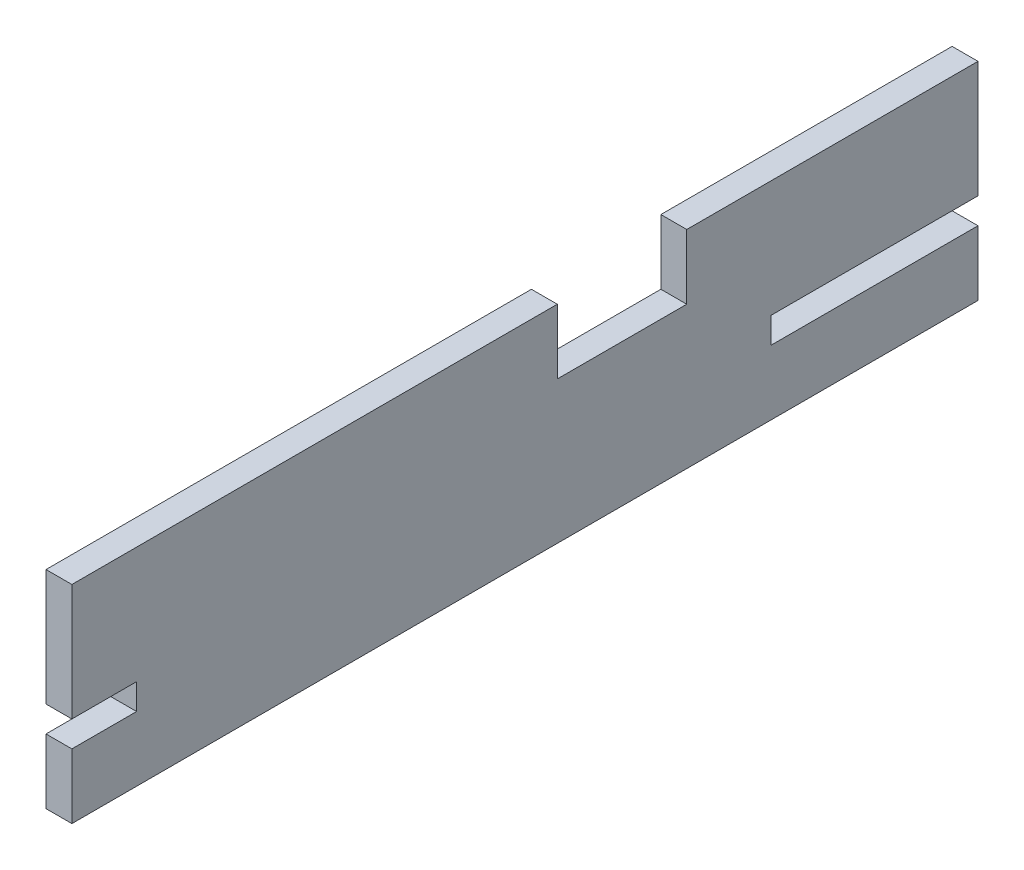
ISO-10303-21;
HEADER;
FILE_DESCRIPTION(('STEP AP214'),'2;1');
FILE_NAME('part.step','',(''),(''),'','','');
FILE_SCHEMA(('AUTOMOTIVE_DESIGN { 1 0 10303 214 1 1 1 1 }'));
ENDSEC;
DATA;
#1=APPLICATION_CONTEXT('core data for automotive mechanical design processes');
#2=APPLICATION_PROTOCOL_DEFINITION('international standard','automotive_design',2000,#1);
#3=PRODUCT_CONTEXT('',#1,'mechanical');
#4=PRODUCT('Part','Part','',(#3));
#5=PRODUCT_RELATED_PRODUCT_CATEGORY('part','',(#4));
#6=PRODUCT_DEFINITION_FORMATION('','',#4);
#7=PRODUCT_DEFINITION_CONTEXT('part definition',#1,'design');
#8=PRODUCT_DEFINITION('design','',#6,#7);
#9=PRODUCT_DEFINITION_SHAPE('','',#8);
#10=(LENGTH_UNIT() NAMED_UNIT(*) SI_UNIT(.MILLI.,.METRE.));
#11=(NAMED_UNIT(*) PLANE_ANGLE_UNIT() SI_UNIT($,.RADIAN.));
#12=(NAMED_UNIT(*) SI_UNIT($,.STERADIAN.) SOLID_ANGLE_UNIT());
#13=UNCERTAINTY_MEASURE_WITH_UNIT(LENGTH_MEASURE(1.E-05),#10,'distance_accuracy_value','');
#14=(GEOMETRIC_REPRESENTATION_CONTEXT(3) GLOBAL_UNCERTAINTY_ASSIGNED_CONTEXT((#13)) GLOBAL_UNIT_ASSIGNED_CONTEXT((#10,
#11,#12)) REPRESENTATION_CONTEXT('',''));
#15=CARTESIAN_POINT('',(0.,0.,0.));
#16=DIRECTION('',(0.,0.,1.));
#17=DIRECTION('',(1.,0.,0.));
#18=AXIS2_PLACEMENT_3D('',#15,#16,#17);
#19=CARTESIAN_POINT('',(4.,15.5611839884913,-15.3184333224336));
#20=DIRECTION('',(0.,-1.,0.));
#21=DIRECTION('',(0.,0.,-1.));
#22=AXIS2_PLACEMENT_3D('',#19,#20,#21);
#23=PLANE('',#22);
#24=DIRECTION('',(0.,0.,1.));
#25=VECTOR('',#24,1.);
#26=CARTESIAN_POINT('',(0.,15.5611839884913,-15.3184333224336));
#27=LINE('',#26,#25);
#28=CARTESIAN_POINT('',(0.,15.5611839884913,-15.3184333224336));
#29=VERTEX_POINT('',#28);
#30=CARTESIAN_POINT('',(0.,15.5611839884913,59.6815666775664));
#31=VERTEX_POINT('',#30);
#32=EDGE_CURVE('E188',#29,#31,#27,.T.);
#33=ORIENTED_EDGE('',*,*,#32,.T.);
#34=DIRECTION('',(-1.,0.,0.));
#35=VECTOR('',#34,1.);
#36=CARTESIAN_POINT('',(4.,15.5611839884913,59.6815666775664));
#37=LINE('',#36,#35);
#38=CARTESIAN_POINT('',(4.,15.5611839884913,59.6815666775664));
#39=VERTEX_POINT('',#38);
#40=EDGE_CURVE('E11',#39,#31,#37,.T.);
#41=ORIENTED_EDGE('',*,*,#40,.F.);
#42=DIRECTION('',(0.,0.,1.));
#43=VECTOR('',#42,1.);
#44=CARTESIAN_POINT('',(4.,15.5611839884913,-15.3184333224336));
#45=LINE('',#44,#43);
#46=CARTESIAN_POINT('',(4.,15.5611839884913,-15.3184333224336));
#47=VERTEX_POINT('',#46);
#48=EDGE_CURVE('E234',#47,#39,#45,.T.);
#49=ORIENTED_EDGE('',*,*,#48,.F.);
#50=DIRECTION('',(-1.,0.,0.));
#51=VECTOR('',#50,1.);
#52=CARTESIAN_POINT('',(4.,15.5611839884913,-15.3184333224336));
#53=LINE('',#52,#51);
#54=EDGE_CURVE('E184',#47,#29,#53,.T.);
#55=ORIENTED_EDGE('',*,*,#54,.T.);
#56=EDGE_LOOP('',(#33,#41,#49,#55));
#57=FACE_BOUND('',#56,.T.);
#58=ADVANCED_FACE('F39',(#57),#23,.F.);
#59=CARTESIAN_POINT('',(4.,15.5611839884913,59.6815666775664));
#60=DIRECTION('',(0.,0.,-1.));
#61=DIRECTION('',(-1.,0.,0.));
#62=AXIS2_PLACEMENT_3D('',#59,#60,#61);
#63=PLANE('',#62);
#64=DIRECTION('',(0.,-1.,0.));
#65=VECTOR('',#64,1.);
#66=CARTESIAN_POINT('',(0.,15.5611839884913,59.6815666775664));
#67=LINE('',#66,#65);
#68=CARTESIAN_POINT('',(0.,-2.43881601150869,59.6815666775664));
#69=VERTEX_POINT('',#68);
#70=EDGE_CURVE('E192',#31,#69,#67,.T.);
#71=ORIENTED_EDGE('',*,*,#70,.T.);
#72=DIRECTION('',(-1.,0.,0.));
#73=VECTOR('',#72,1.);
#74=CARTESIAN_POINT('',(4.,-2.43881601150869,59.6815666775664));
#75=LINE('',#74,#73);
#76=CARTESIAN_POINT('',(4.,-2.43881601150869,59.6815666775664));
#77=VERTEX_POINT('',#76);
#78=EDGE_CURVE('E48',#77,#69,#75,.T.);
#79=ORIENTED_EDGE('',*,*,#78,.F.);
#80=DIRECTION('',(0.,-1.,0.));
#81=VECTOR('',#80,1.);
#82=CARTESIAN_POINT('',(4.,15.5611839884913,59.6815666775664));
#83=LINE('',#82,#81);
#84=EDGE_CURVE('E123',#39,#77,#83,.T.);
#85=ORIENTED_EDGE('',*,*,#84,.F.);
#86=ORIENTED_EDGE('',*,*,#40,.T.);
#87=EDGE_LOOP('',(#71,#79,#85,#86));
#88=FACE_BOUND('',#87,.T.);
#89=ADVANCED_FACE('F356',(#88),#63,.F.);
#90=CARTESIAN_POINT('',(4.,-2.43881601150869,59.6815666775664));
#91=DIRECTION('',(0.,1.,0.));
#92=DIRECTION('',(0.,0.,1.));
#93=AXIS2_PLACEMENT_3D('',#90,#91,#92);
#94=PLANE('',#93);
#95=DIRECTION('',(0.,0.,-1.));
#96=VECTOR('',#95,1.);
#97=CARTESIAN_POINT('',(0.,-2.43881601150869,59.6815666775664));
#98=LINE('',#97,#96);
#99=CARTESIAN_POINT('',(0.,-2.43881601150869,49.6815666775664));
#100=VERTEX_POINT('',#99);
#101=EDGE_CURVE('E195',#69,#100,#98,.T.);
#102=ORIENTED_EDGE('',*,*,#101,.T.);
#103=DIRECTION('',(-1.,0.,0.));
#104=VECTOR('',#103,1.);
#105=CARTESIAN_POINT('',(4.,-2.43881601150869,49.6815666775664));
#106=LINE('',#105,#104);
#107=CARTESIAN_POINT('',(4.,-2.43881601150869,49.6815666775664));
#108=VERTEX_POINT('',#107);
#109=EDGE_CURVE('E277',#108,#100,#106,.T.);
#110=ORIENTED_EDGE('',*,*,#109,.F.);
#111=DIRECTION('',(0.,0.,-1.));
#112=VECTOR('',#111,1.);
#113=CARTESIAN_POINT('',(4.,-2.43881601150869,59.6815666775664));
#114=LINE('',#113,#112);
#115=EDGE_CURVE('E287',#77,#108,#114,.T.);
#116=ORIENTED_EDGE('',*,*,#115,.F.);
#117=ORIENTED_EDGE('',*,*,#78,.T.);
#118=EDGE_LOOP('',(#102,#110,#116,#117));
#119=FACE_BOUND('',#118,.T.);
#120=ADVANCED_FACE('F285',(#119),#94,.F.);
#121=CARTESIAN_POINT('',(4.,-2.43881601150869,49.6815666775664));
#122=DIRECTION('',(0.,0.,-1.));
#123=DIRECTION('',(-1.,0.,0.));
#124=AXIS2_PLACEMENT_3D('',#121,#122,#123);
#125=PLANE('',#124);
#126=DIRECTION('',(0.,-1.,0.));
#127=VECTOR('',#126,1.);
#128=CARTESIAN_POINT('',(0.,-2.43881601150869,49.6815666775664));
#129=LINE('',#128,#127);
#130=CARTESIAN_POINT('',(0.,-6.43881601150869,49.6815666775664));
#131=VERTEX_POINT('',#130);
#132=EDGE_CURVE('E198',#100,#131,#129,.T.);
#133=ORIENTED_EDGE('',*,*,#132,.T.);
#134=DIRECTION('',(-1.,0.,0.));
#135=VECTOR('',#134,1.);
#136=CARTESIAN_POINT('',(4.,-6.43881601150869,49.6815666775664));
#137=LINE('',#136,#135);
#138=CARTESIAN_POINT('',(4.,-6.43881601150869,49.6815666775664));
#139=VERTEX_POINT('',#138);
#140=EDGE_CURVE('E273',#139,#131,#137,.T.);
#141=ORIENTED_EDGE('',*,*,#140,.F.);
#142=DIRECTION('',(0.,-1.,0.));
#143=VECTOR('',#142,1.);
#144=CARTESIAN_POINT('',(4.,-2.43881601150869,49.6815666775664));
#145=LINE('',#144,#143);
#146=EDGE_CURVE('E306',#108,#139,#145,.T.);
#147=ORIENTED_EDGE('',*,*,#146,.F.);
#148=ORIENTED_EDGE('',*,*,#109,.T.);
#149=EDGE_LOOP('',(#133,#141,#147,#148));
#150=FACE_BOUND('',#149,.T.);
#151=ADVANCED_FACE('F296',(#150),#125,.F.);
#152=CARTESIAN_POINT('',(4.,-6.43881601150869,49.6815666775664));
#153=DIRECTION('',(0.,-1.,0.));
#154=DIRECTION('',(0.,0.,-1.));
#155=AXIS2_PLACEMENT_3D('',#152,#153,#154);
#156=PLANE('',#155);
#157=DIRECTION('',(0.,0.,1.));
#158=VECTOR('',#157,1.);
#159=CARTESIAN_POINT('',(0.,-6.43881601150869,49.6815666775664));
#160=LINE('',#159,#158);
#161=CARTESIAN_POINT('',(0.,-6.43881601150869,59.6815666775664));
#162=VERTEX_POINT('',#161);
#163=EDGE_CURVE('E201',#131,#162,#160,.T.);
#164=ORIENTED_EDGE('',*,*,#163,.T.);
#165=DIRECTION('',(-1.,0.,0.));
#166=VECTOR('',#165,1.);
#167=CARTESIAN_POINT('',(4.,-6.43881601150869,59.6815666775664));
#168=LINE('',#167,#166);
#169=CARTESIAN_POINT('',(4.,-6.43881601150869,59.6815666775664));
#170=VERTEX_POINT('',#169);
#171=EDGE_CURVE('E269',#170,#162,#168,.T.);
#172=ORIENTED_EDGE('',*,*,#171,.F.);
#173=DIRECTION('',(0.,0.,1.));
#174=VECTOR('',#173,1.);
#175=CARTESIAN_POINT('',(4.,-6.43881601150869,49.6815666775664));
#176=LINE('',#175,#174);
#177=EDGE_CURVE('E302',#139,#170,#176,.T.);
#178=ORIENTED_EDGE('',*,*,#177,.F.);
#179=ORIENTED_EDGE('',*,*,#140,.T.);
#180=EDGE_LOOP('',(#164,#172,#178,#179));
#181=FACE_BOUND('',#180,.T.);
#182=ADVANCED_FACE('F300',(#181),#156,.F.);
#183=CARTESIAN_POINT('',(4.,-6.43881601150869,59.6815666775664));
#184=DIRECTION('',(0.,0.,-1.));
#185=DIRECTION('',(-1.,0.,0.));
#186=AXIS2_PLACEMENT_3D('',#183,#184,#185);
#187=PLANE('',#186);
#188=DIRECTION('',(0.,-1.,0.));
#189=VECTOR('',#188,1.);
#190=CARTESIAN_POINT('',(0.,-6.43881601150869,59.6815666775664));
#191=LINE('',#190,#189);
#192=CARTESIAN_POINT('',(0.,-16.4388160115087,59.6815666775664));
#193=VERTEX_POINT('',#192);
#194=EDGE_CURVE('E204',#162,#193,#191,.T.);
#195=ORIENTED_EDGE('',*,*,#194,.T.);
#196=DIRECTION('',(-1.,0.,0.));
#197=VECTOR('',#196,1.);
#198=CARTESIAN_POINT('',(4.,-16.4388160115087,59.6815666775664));
#199=LINE('',#198,#197);
#200=CARTESIAN_POINT('',(4.,-16.4388160115087,59.6815666775664));
#201=VERTEX_POINT('',#200);
#202=EDGE_CURVE('E265',#201,#193,#199,.T.);
#203=ORIENTED_EDGE('',*,*,#202,.F.);
#204=DIRECTION('',(0.,-1.,0.));
#205=VECTOR('',#204,1.);
#206=CARTESIAN_POINT('',(4.,-6.43881601150869,59.6815666775664));
#207=LINE('',#206,#205);
#208=EDGE_CURVE('E305',#170,#201,#207,.T.);
#209=ORIENTED_EDGE('',*,*,#208,.F.);
#210=ORIENTED_EDGE('',*,*,#171,.T.);
#211=EDGE_LOOP('',(#195,#203,#209,#210));
#212=FACE_BOUND('',#211,.T.);
#213=ADVANCED_FACE('F369',(#212),#187,.F.);
#214=CARTESIAN_POINT('',(4.,-16.4388160115087,59.6815666775664));
#215=DIRECTION('',(0.,1.,0.));
#216=DIRECTION('',(0.,0.,1.));
#217=AXIS2_PLACEMENT_3D('',#214,#215,#216);
#218=PLANE('',#217);
#219=DIRECTION('',(0.,0.,-1.));
#220=VECTOR('',#219,1.);
#221=CARTESIAN_POINT('',(0.,-16.4388160115087,59.6815666775664));
#222=LINE('',#221,#220);
#223=CARTESIAN_POINT('',(0.,-16.4388160115087,-80.3184333224336));
#224=VERTEX_POINT('',#223);
#225=EDGE_CURVE('E207',#193,#224,#222,.T.);
#226=ORIENTED_EDGE('',*,*,#225,.T.);
#227=DIRECTION('',(-1.,0.,0.));
#228=VECTOR('',#227,1.);
#229=CARTESIAN_POINT('',(4.,-16.4388160115087,-80.3184333224336));
#230=LINE('',#229,#228);
#231=CARTESIAN_POINT('',(4.,-16.4388160115087,-80.3184333224336));
#232=VERTEX_POINT('',#231);
#233=EDGE_CURVE('E261',#232,#224,#230,.T.);
#234=ORIENTED_EDGE('',*,*,#233,.F.);
#235=DIRECTION('',(0.,0.,-1.));
#236=VECTOR('',#235,1.);
#237=CARTESIAN_POINT('',(4.,-16.4388160115087,59.6815666775664));
#238=LINE('',#237,#236);
#239=EDGE_CURVE('E310',#201,#232,#238,.T.);
#240=ORIENTED_EDGE('',*,*,#239,.F.);
#241=ORIENTED_EDGE('',*,*,#202,.T.);
#242=EDGE_LOOP('',(#226,#234,#240,#241));
#243=FACE_BOUND('',#242,.T.);
#244=ADVANCED_FACE('F372',(#243),#218,.F.);
#245=CARTESIAN_POINT('',(4.,-16.4388160115087,-80.3184333224336));
#246=DIRECTION('',(0.,0.,1.));
#247=DIRECTION('',(1.,0.,0.));
#248=AXIS2_PLACEMENT_3D('',#245,#246,#247);
#249=PLANE('',#248);
#250=DIRECTION('',(0.,1.,0.));
#251=VECTOR('',#250,1.);
#252=CARTESIAN_POINT('',(0.,-16.4388160115087,-80.3184333224336));
#253=LINE('',#252,#251);
#254=CARTESIAN_POINT('',(0.,-6.43881601150868,-80.3184333224336));
#255=VERTEX_POINT('',#254);
#256=EDGE_CURVE('E210',#224,#255,#253,.T.);
#257=ORIENTED_EDGE('',*,*,#256,.T.);
#258=DIRECTION('',(-1.,0.,0.));
#259=VECTOR('',#258,1.);
#260=CARTESIAN_POINT('',(4.,-6.43881601150868,-80.3184333224336));
#261=LINE('',#260,#259);
#262=CARTESIAN_POINT('',(4.,-6.43881601150868,-80.3184333224336));
#263=VERTEX_POINT('',#262);
#264=EDGE_CURVE('E257',#263,#255,#261,.T.);
#265=ORIENTED_EDGE('',*,*,#264,.F.);
#266=DIRECTION('',(0.,1.,0.));
#267=VECTOR('',#266,1.);
#268=CARTESIAN_POINT('',(4.,-16.4388160115087,-80.3184333224336));
#269=LINE('',#268,#267);
#270=EDGE_CURVE('E317',#232,#263,#269,.T.);
#271=ORIENTED_EDGE('',*,*,#270,.F.);
#272=ORIENTED_EDGE('',*,*,#233,.T.);
#273=EDGE_LOOP('',(#257,#265,#271,#272));
#274=FACE_BOUND('',#273,.T.);
#275=ADVANCED_FACE('F376',(#274),#249,.F.);
#276=CARTESIAN_POINT('',(4.,-6.43881601150868,-80.3184333224336));
#277=DIRECTION('',(0.,-1.,0.));
#278=DIRECTION('',(0.,0.,-1.));
#279=AXIS2_PLACEMENT_3D('',#276,#277,#278);
#280=PLANE('',#279);
#281=DIRECTION('',(0.,0.,1.));
#282=VECTOR('',#281,1.);
#283=CARTESIAN_POINT('',(0.,-6.43881601150868,-80.3184333224336));
#284=LINE('',#283,#282);
#285=CARTESIAN_POINT('',(0.,-6.43881601150868,-48.3184333224336));
#286=VERTEX_POINT('',#285);
#287=EDGE_CURVE('E213',#255,#286,#284,.T.);
#288=ORIENTED_EDGE('',*,*,#287,.T.);
#289=DIRECTION('',(-1.,0.,0.));
#290=VECTOR('',#289,1.);
#291=CARTESIAN_POINT('',(4.,-6.43881601150868,-48.3184333224336));
#292=LINE('',#291,#290);
#293=CARTESIAN_POINT('',(4.,-6.43881601150868,-48.3184333224336));
#294=VERTEX_POINT('',#293);
#295=EDGE_CURVE('E253',#294,#286,#292,.T.);
#296=ORIENTED_EDGE('',*,*,#295,.F.);
#297=DIRECTION('',(0.,0.,1.));
#298=VECTOR('',#297,1.);
#299=CARTESIAN_POINT('',(4.,-6.43881601150868,-80.3184333224336));
#300=LINE('',#299,#298);
#301=EDGE_CURVE('E320',#263,#294,#300,.T.);
#302=ORIENTED_EDGE('',*,*,#301,.F.);
#303=ORIENTED_EDGE('',*,*,#264,.T.);
#304=EDGE_LOOP('',(#288,#296,#302,#303));
#305=FACE_BOUND('',#304,.T.);
#306=ADVANCED_FACE('F380',(#305),#280,.F.);
#307=CARTESIAN_POINT('',(4.,-6.43881601150868,-48.3184333224336));
#308=DIRECTION('',(0.,0.,1.));
#309=DIRECTION('',(1.,0.,0.));
#310=AXIS2_PLACEMENT_3D('',#307,#308,#309);
#311=PLANE('',#310);
#312=DIRECTION('',(0.,1.,0.));
#313=VECTOR('',#312,1.);
#314=CARTESIAN_POINT('',(0.,-6.43881601150868,-48.3184333224336));
#315=LINE('',#314,#313);
#316=CARTESIAN_POINT('',(0.,-2.43881601150869,-48.3184333224336));
#317=VERTEX_POINT('',#316);
#318=EDGE_CURVE('E216',#286,#317,#315,.T.);
#319=ORIENTED_EDGE('',*,*,#318,.T.);
#320=DIRECTION('',(-1.,0.,0.));
#321=VECTOR('',#320,1.);
#322=CARTESIAN_POINT('',(4.,-2.43881601150869,-48.3184333224336));
#323=LINE('',#322,#321);
#324=CARTESIAN_POINT('',(4.,-2.43881601150869,-48.3184333224336));
#325=VERTEX_POINT('',#324);
#326=EDGE_CURVE('E249',#325,#317,#323,.T.);
#327=ORIENTED_EDGE('',*,*,#326,.F.);
#328=DIRECTION('',(0.,1.,0.));
#329=VECTOR('',#328,1.);
#330=CARTESIAN_POINT('',(4.,-6.43881601150868,-48.3184333224336));
#331=LINE('',#330,#329);
#332=EDGE_CURVE('E323',#294,#325,#331,.T.);
#333=ORIENTED_EDGE('',*,*,#332,.F.);
#334=ORIENTED_EDGE('',*,*,#295,.T.);
#335=EDGE_LOOP('',(#319,#327,#333,#334));
#336=FACE_BOUND('',#335,.T.);
#337=ADVANCED_FACE('F384',(#336),#311,.F.);
#338=CARTESIAN_POINT('',(4.,-2.43881601150869,-48.3184333224336));
#339=DIRECTION('',(0.,1.,0.));
#340=DIRECTION('',(0.,0.,1.));
#341=AXIS2_PLACEMENT_3D('',#338,#339,#340);
#342=PLANE('',#341);
#343=DIRECTION('',(0.,0.,-1.));
#344=VECTOR('',#343,1.);
#345=CARTESIAN_POINT('',(0.,-2.43881601150869,-48.3184333224336));
#346=LINE('',#345,#344);
#347=CARTESIAN_POINT('',(0.,-2.43881601150869,-80.3184333224336));
#348=VERTEX_POINT('',#347);
#349=EDGE_CURVE('E219',#317,#348,#346,.T.);
#350=ORIENTED_EDGE('',*,*,#349,.T.);
#351=DIRECTION('',(-1.,0.,0.));
#352=VECTOR('',#351,1.);
#353=CARTESIAN_POINT('',(4.,-2.43881601150869,-80.3184333224336));
#354=LINE('',#353,#352);
#355=CARTESIAN_POINT('',(4.,-2.43881601150869,-80.3184333224336));
#356=VERTEX_POINT('',#355);
#357=EDGE_CURVE('E245',#356,#348,#354,.T.);
#358=ORIENTED_EDGE('',*,*,#357,.F.);
#359=DIRECTION('',(0.,0.,-1.));
#360=VECTOR('',#359,1.);
#361=CARTESIAN_POINT('',(4.,-2.43881601150869,-48.3184333224336));
#362=LINE('',#361,#360);
#363=EDGE_CURVE('E326',#325,#356,#362,.T.);
#364=ORIENTED_EDGE('',*,*,#363,.F.);
#365=ORIENTED_EDGE('',*,*,#326,.T.);
#366=EDGE_LOOP('',(#350,#358,#364,#365));
#367=FACE_BOUND('',#366,.T.);
#368=ADVANCED_FACE('F388',(#367),#342,.F.);
#369=CARTESIAN_POINT('',(4.,-2.43881601150869,-80.3184333224336));
#370=DIRECTION('',(0.,0.,1.));
#371=DIRECTION('',(1.,0.,0.));
#372=AXIS2_PLACEMENT_3D('',#369,#370,#371);
#373=PLANE('',#372);
#374=DIRECTION('',(0.,1.,0.));
#375=VECTOR('',#374,1.);
#376=CARTESIAN_POINT('',(0.,-2.43881601150869,-80.3184333224336));
#377=LINE('',#376,#375);
#378=CARTESIAN_POINT('',(0.,15.5611839884913,-80.3184333224336));
#379=VERTEX_POINT('',#378);
#380=EDGE_CURVE('E222',#348,#379,#377,.T.);
#381=ORIENTED_EDGE('',*,*,#380,.T.);
#382=DIRECTION('',(-1.,0.,0.));
#383=VECTOR('',#382,1.);
#384=CARTESIAN_POINT('',(4.,15.5611839884913,-80.3184333224336));
#385=LINE('',#384,#383);
#386=CARTESIAN_POINT('',(4.,15.5611839884913,-80.3184333224336));
#387=VERTEX_POINT('',#386);
#388=EDGE_CURVE('E241',#387,#379,#385,.T.);
#389=ORIENTED_EDGE('',*,*,#388,.F.);
#390=DIRECTION('',(0.,1.,0.));
#391=VECTOR('',#390,1.);
#392=CARTESIAN_POINT('',(4.,-2.43881601150869,-80.3184333224336));
#393=LINE('',#392,#391);
#394=EDGE_CURVE('E329',#356,#387,#393,.T.);
#395=ORIENTED_EDGE('',*,*,#394,.F.);
#396=ORIENTED_EDGE('',*,*,#357,.T.);
#397=EDGE_LOOP('',(#381,#389,#395,#396));
#398=FACE_BOUND('',#397,.T.);
#399=ADVANCED_FACE('F337',(#398),#373,.F.);
#400=CARTESIAN_POINT('',(4.,15.5611839884913,-35.3184333224336));
#401=DIRECTION('',(0.,-1.,0.));
#402=DIRECTION('',(0.,0.,-1.));
#403=AXIS2_PLACEMENT_3D('',#400,#401,#402);
#404=PLANE('',#403);
#405=DIRECTION('',(0.,0.,1.));
#406=VECTOR('',#405,1.);
#407=CARTESIAN_POINT('',(0.,15.5611839884913,-35.3184333224336));
#408=LINE('',#407,#406);
#409=CARTESIAN_POINT('',(0.,15.5611839884913,-35.3184333224336));
#410=VERTEX_POINT('',#409);
#411=EDGE_CURVE('E225',#379,#410,#408,.T.);
#412=ORIENTED_EDGE('',*,*,#411,.T.);
#413=DIRECTION('',(-1.,0.,0.));
#414=VECTOR('',#413,1.);
#415=CARTESIAN_POINT('',(4.,15.5611839884913,-35.3184333224336));
#416=LINE('',#415,#414);
#417=CARTESIAN_POINT('',(4.,15.5611839884913,-35.3184333224336));
#418=VERTEX_POINT('',#417);
#419=EDGE_CURVE('E177',#418,#410,#416,.T.);
#420=ORIENTED_EDGE('',*,*,#419,.F.);
#421=DIRECTION('',(0.,0.,1.));
#422=VECTOR('',#421,1.);
#423=CARTESIAN_POINT('',(4.,15.5611839884913,-35.3184333224336));
#424=LINE('',#423,#422);
#425=EDGE_CURVE('E166',#387,#418,#424,.T.);
#426=ORIENTED_EDGE('',*,*,#425,.F.);
#427=ORIENTED_EDGE('',*,*,#388,.T.);
#428=EDGE_LOOP('',(#412,#420,#426,#427));
#429=FACE_BOUND('',#428,.T.);
#430=ADVANCED_FACE('F341',(#429),#404,.F.);
#431=CARTESIAN_POINT('',(4.,5.56118398849133,-35.3184333224336));
#432=DIRECTION('',(0.,0.,-1.));
#433=DIRECTION('',(-1.,0.,0.));
#434=AXIS2_PLACEMENT_3D('',#431,#432,#433);
#435=PLANE('',#434);
#436=DIRECTION('',(0.,-1.,0.));
#437=VECTOR('',#436,1.);
#438=CARTESIAN_POINT('',(0.,5.56118398849133,-35.3184333224336));
#439=LINE('',#438,#437);
#440=CARTESIAN_POINT('',(0.,5.56118398849133,-35.3184333224336));
#441=VERTEX_POINT('',#440);
#442=EDGE_CURVE('E175',#410,#441,#439,.T.);
#443=ORIENTED_EDGE('',*,*,#442,.T.);
#444=DIRECTION('',(-1.,0.,0.));
#445=VECTOR('',#444,1.);
#446=CARTESIAN_POINT('',(4.,5.56118398849133,-35.3184333224336));
#447=LINE('',#446,#445);
#448=CARTESIAN_POINT('',(4.,5.56118398849133,-35.3184333224336));
#449=VERTEX_POINT('',#448);
#450=EDGE_CURVE('E172',#449,#441,#447,.T.);
#451=ORIENTED_EDGE('',*,*,#450,.F.);
#452=DIRECTION('',(0.,-1.,0.));
#453=VECTOR('',#452,1.);
#454=CARTESIAN_POINT('',(4.,5.56118398849133,-35.3184333224336));
#455=LINE('',#454,#453);
#456=EDGE_CURVE('E160',#418,#449,#455,.T.);
#457=ORIENTED_EDGE('',*,*,#456,.F.);
#458=ORIENTED_EDGE('',*,*,#419,.T.);
#459=EDGE_LOOP('',(#443,#451,#457,#458));
#460=FACE_BOUND('',#459,.T.);
#461=ADVANCED_FACE('F173',(#460),#435,.F.);
#462=CARTESIAN_POINT('',(4.,5.56118398849133,-15.3184333224336));
#463=DIRECTION('',(0.,-1.,0.));
#464=DIRECTION('',(0.,0.,-1.));
#465=AXIS2_PLACEMENT_3D('',#462,#463,#464);
#466=PLANE('',#465);
#467=DIRECTION('',(0.,0.,1.));
#468=VECTOR('',#467,1.);
#469=CARTESIAN_POINT('',(0.,5.56118398849133,-15.3184333224336));
#470=LINE('',#469,#468);
#471=CARTESIAN_POINT('',(0.,5.56118398849133,-15.3184333224336));
#472=VERTEX_POINT('',#471);
#473=EDGE_CURVE('E109',#441,#472,#470,.T.);
#474=ORIENTED_EDGE('',*,*,#473,.T.);
#475=DIRECTION('',(-1.,0.,0.));
#476=VECTOR('',#475,1.);
#477=CARTESIAN_POINT('',(4.,5.56118398849133,-15.3184333224336));
#478=LINE('',#477,#476);
#479=CARTESIAN_POINT('',(4.,5.56118398849133,-15.3184333224336));
#480=VERTEX_POINT('',#479);
#481=EDGE_CURVE('E178',#480,#472,#478,.T.);
#482=ORIENTED_EDGE('',*,*,#481,.F.);
#483=DIRECTION('',(0.,0.,1.));
#484=VECTOR('',#483,1.);
#485=CARTESIAN_POINT('',(4.,5.56118398849133,-15.3184333224336));
#486=LINE('',#485,#484);
#487=EDGE_CURVE('E164',#449,#480,#486,.T.);
#488=ORIENTED_EDGE('',*,*,#487,.F.);
#489=ORIENTED_EDGE('',*,*,#450,.T.);
#490=EDGE_LOOP('',(#474,#482,#488,#489));
#491=FACE_BOUND('',#490,.T.);
#492=ADVANCED_FACE('F180',(#491),#466,.F.);
#493=CARTESIAN_POINT('',(4.,15.5611839884913,-15.3184333224336));
#494=DIRECTION('',(0.,0.,1.));
#495=DIRECTION('',(0.,-1.,0.));
#496=AXIS2_PLACEMENT_3D('',#493,#494,#495);
#497=PLANE('',#496);
#498=DIRECTION('',(0.,1.,0.));
#499=VECTOR('',#498,1.);
#500=CARTESIAN_POINT('',(0.,15.5611839884913,-15.3184333224336));
#501=LINE('',#500,#499);
#502=EDGE_CURVE('E115',#472,#29,#501,.T.);
#503=ORIENTED_EDGE('',*,*,#502,.T.);
#504=ORIENTED_EDGE('',*,*,#54,.F.);
#505=DIRECTION('',(0.,1.,0.));
#506=VECTOR('',#505,1.);
#507=CARTESIAN_POINT('',(4.,15.5611839884913,-15.3184333224336));
#508=LINE('',#507,#506);
#509=EDGE_CURVE('E56',#480,#47,#508,.T.);
#510=ORIENTED_EDGE('',*,*,#509,.F.);
#511=ORIENTED_EDGE('',*,*,#481,.T.);
#512=EDGE_LOOP('',(#503,#504,#510,#511));
#513=FACE_BOUND('',#512,.T.);
#514=ADVANCED_FACE('F345',(#513),#497,.F.);
#515=CARTESIAN_POINT('',(4.,0.,0.));
#516=DIRECTION('',(1.,0.,0.));
#517=DIRECTION('',(0.,0.,-1.));
#518=AXIS2_PLACEMENT_3D('',#515,#516,#517);
#519=PLANE('',#518);
#520=ORIENTED_EDGE('',*,*,#48,.T.);
#521=ORIENTED_EDGE('',*,*,#84,.T.);
#522=ORIENTED_EDGE('',*,*,#115,.T.);
#523=ORIENTED_EDGE('',*,*,#146,.T.);
#524=ORIENTED_EDGE('',*,*,#177,.T.);
#525=ORIENTED_EDGE('',*,*,#208,.T.);
#526=ORIENTED_EDGE('',*,*,#239,.T.);
#527=ORIENTED_EDGE('',*,*,#270,.T.);
#528=ORIENTED_EDGE('',*,*,#301,.T.);
#529=ORIENTED_EDGE('',*,*,#332,.T.);
#530=ORIENTED_EDGE('',*,*,#363,.T.);
#531=ORIENTED_EDGE('',*,*,#394,.T.);
#532=ORIENTED_EDGE('',*,*,#425,.T.);
#533=ORIENTED_EDGE('',*,*,#456,.T.);
#534=ORIENTED_EDGE('',*,*,#487,.T.);
#535=ORIENTED_EDGE('',*,*,#509,.T.);
#536=EDGE_LOOP('',(#520,#521,#522,#523,#524,#525,#526,#527,#528,#529,#530,#531,#532,#533,#534,#535));
#537=FACE_BOUND('',#536,.T.);
#538=ADVANCED_FACE('F162',(#537),#519,.T.);
#539=CARTESIAN_POINT('',(0.,0.,0.));
#540=DIRECTION('',(1.,0.,0.));
#541=DIRECTION('',(0.,0.,-1.));
#542=AXIS2_PLACEMENT_3D('',#539,#540,#541);
#543=PLANE('',#542);
#544=ORIENTED_EDGE('',*,*,#32,.F.);
#545=ORIENTED_EDGE('',*,*,#502,.F.);
#546=ORIENTED_EDGE('',*,*,#473,.F.);
#547=ORIENTED_EDGE('',*,*,#442,.F.);
#548=ORIENTED_EDGE('',*,*,#411,.F.);
#549=ORIENTED_EDGE('',*,*,#380,.F.);
#550=ORIENTED_EDGE('',*,*,#349,.F.);
#551=ORIENTED_EDGE('',*,*,#318,.F.);
#552=ORIENTED_EDGE('',*,*,#287,.F.);
#553=ORIENTED_EDGE('',*,*,#256,.F.);
#554=ORIENTED_EDGE('',*,*,#225,.F.);
#555=ORIENTED_EDGE('',*,*,#194,.F.);
#556=ORIENTED_EDGE('',*,*,#163,.F.);
#557=ORIENTED_EDGE('',*,*,#132,.F.);
#558=ORIENTED_EDGE('',*,*,#101,.F.);
#559=ORIENTED_EDGE('',*,*,#70,.F.);
#560=EDGE_LOOP('',(#544,#545,#546,#547,#548,#549,#550,#551,#552,#553,#554,#555,#556,#557,#558,#559));
#561=FACE_BOUND('',#560,.T.);
#562=ADVANCED_FACE('F291',(#561),#543,.F.);
#563=CLOSED_SHELL('',(#58,#89,#120,#151,#182,#213,#244,#275,#306,#337,#368,#399,#430,#461,#492,
#514,#538,#562));
#564=MANIFOLD_SOLID_BREP('B2',#563);
#565=ADVANCED_BREP_SHAPE_REPRESENTATION('',(#18,#564),#14);
#566=SHAPE_DEFINITION_REPRESENTATION(#9,#565);
ENDSEC;
END-ISO-10303-21;
